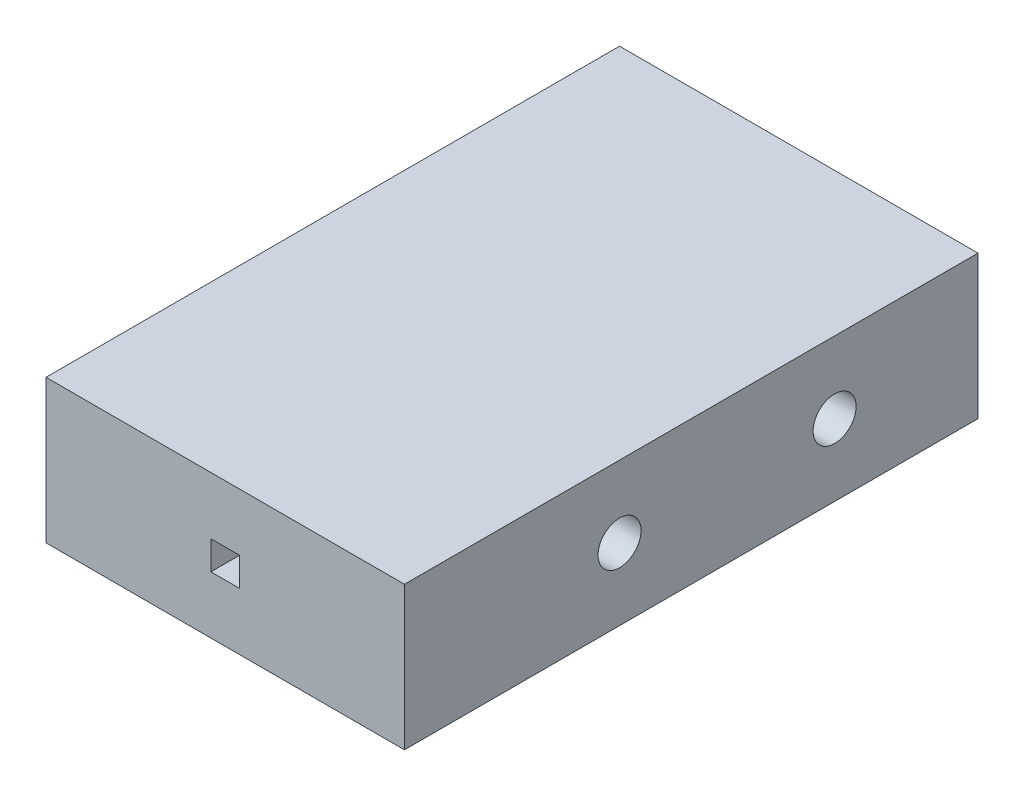
ISO-10303-21;
HEADER;
FILE_DESCRIPTION(('STEP AP214'),'2;1');
FILE_NAME('part.step','',(''),(''),'','','');
FILE_SCHEMA(('AUTOMOTIVE_DESIGN { 1 0 10303 214 1 1 1 1 }'));
ENDSEC;
DATA;
#1=APPLICATION_CONTEXT('core data for automotive mechanical design processes');
#2=APPLICATION_PROTOCOL_DEFINITION('international standard','automotive_design',2000,#1);
#3=PRODUCT_CONTEXT('',#1,'mechanical');
#4=PRODUCT('Part','Part','',(#3));
#5=PRODUCT_RELATED_PRODUCT_CATEGORY('part','',(#4));
#6=PRODUCT_DEFINITION_FORMATION('','',#4);
#7=PRODUCT_DEFINITION_CONTEXT('part definition',#1,'design');
#8=PRODUCT_DEFINITION('design','',#6,#7);
#9=PRODUCT_DEFINITION_SHAPE('','',#8);
#10=(LENGTH_UNIT() NAMED_UNIT(*) SI_UNIT(.MILLI.,.METRE.));
#11=(NAMED_UNIT(*) PLANE_ANGLE_UNIT() SI_UNIT($,.RADIAN.));
#12=(NAMED_UNIT(*) SI_UNIT($,.STERADIAN.) SOLID_ANGLE_UNIT());
#13=UNCERTAINTY_MEASURE_WITH_UNIT(LENGTH_MEASURE(1.E-05),#10,'distance_accuracy_value','');
#14=(GEOMETRIC_REPRESENTATION_CONTEXT(3) GLOBAL_UNCERTAINTY_ASSIGNED_CONTEXT((#13)) GLOBAL_UNIT_ASSIGNED_CONTEXT((#10,
#11,#12)) REPRESENTATION_CONTEXT('',''));
#15=CARTESIAN_POINT('',(0.,0.,0.));
#16=DIRECTION('',(0.,0.,1.));
#17=DIRECTION('',(1.,0.,0.));
#18=AXIS2_PLACEMENT_3D('',#15,#16,#17);
#19=CARTESIAN_POINT('',(-12.5,10.,20.));
#20=DIRECTION('',(1.,0.,0.));
#21=DIRECTION('',(0.,0.,-1.));
#22=AXIS2_PLACEMENT_3D('',#19,#20,#21);
#23=PLANE('',#22);
#24=CARTESIAN_POINT('',(-12.5,5.,5.));
#25=DIRECTION('',(-1.,0.,0.));
#26=DIRECTION('',(0.,0.,1.));
#27=AXIS2_PLACEMENT_3D('',#24,#25,#26);
#28=CIRCLE('',#27,1.5);
#29=CARTESIAN_POINT('',(-12.5,5.,6.50000000000001));
#30=VERTEX_POINT('',#29);
#31=EDGE_CURVE('E219',#30,#30,#28,.T.);
#32=ORIENTED_EDGE('',*,*,#31,.F.);
#33=EDGE_LOOP('',(#32));
#34=FACE_BOUND('',#33,.T.);
#35=CARTESIAN_POINT('',(-12.5,5.,-10.));
#36=DIRECTION('',(1.,0.,0.));
#37=DIRECTION('',(0.,0.,-1.));
#38=AXIS2_PLACEMENT_3D('',#35,#36,#37);
#39=CIRCLE('',#38,1.5);
#40=CARTESIAN_POINT('',(-12.5,5.,-11.5));
#41=VERTEX_POINT('',#40);
#42=EDGE_CURVE('E222',#41,#41,#39,.T.);
#43=ORIENTED_EDGE('',*,*,#42,.T.);
#44=EDGE_LOOP('',(#43));
#45=FACE_BOUND('',#44,.T.);
#46=DIRECTION('',(0.,0.,1.));
#47=VECTOR('',#46,1.);
#48=CARTESIAN_POINT('',(-12.5,0.,20.));
#49=LINE('',#48,#47);
#50=CARTESIAN_POINT('',(-12.5,0.,-20.));
#51=VERTEX_POINT('',#50);
#52=CARTESIAN_POINT('',(-12.5,0.,20.));
#53=VERTEX_POINT('',#52);
#54=EDGE_CURVE('E225',#51,#53,#49,.T.);
#55=ORIENTED_EDGE('',*,*,#54,.T.);
#56=DIRECTION('',(0.,-1.,0.));
#57=VECTOR('',#56,1.);
#58=CARTESIAN_POINT('',(-12.5,10.,20.));
#59=LINE('',#58,#57);
#60=CARTESIAN_POINT('',(-12.5,10.,20.));
#61=VERTEX_POINT('',#60);
#62=EDGE_CURVE('E254',#61,#53,#59,.T.);
#63=ORIENTED_EDGE('',*,*,#62,.F.);
#64=DIRECTION('',(0.,0.,1.));
#65=VECTOR('',#64,1.);
#66=CARTESIAN_POINT('',(-12.5,10.,20.));
#67=LINE('',#66,#65);
#68=CARTESIAN_POINT('',(-12.5,10.,-20.));
#69=VERTEX_POINT('',#68);
#70=EDGE_CURVE('E228',#69,#61,#67,.T.);
#71=ORIENTED_EDGE('',*,*,#70,.F.);
#72=DIRECTION('',(0.,-1.,0.));
#73=VECTOR('',#72,1.);
#74=CARTESIAN_POINT('',(-12.5,10.,-20.));
#75=LINE('',#74,#73);
#76=EDGE_CURVE('E238',#69,#51,#75,.T.);
#77=ORIENTED_EDGE('',*,*,#76,.T.);
#78=EDGE_LOOP('',(#55,#63,#71,#77));
#79=FACE_BOUND('',#78,.T.);
#80=ADVANCED_FACE('F31',(#34,#45,#79),#23,.F.);
#81=CARTESIAN_POINT('',(12.5,10.,20.));
#82=DIRECTION('',(0.,0.,-1.));
#83=DIRECTION('',(-1.,0.,0.));
#84=AXIS2_PLACEMENT_3D('',#81,#82,#83);
#85=PLANE('',#84);
#86=DIRECTION('',(1.,0.,0.));
#87=VECTOR('',#86,1.);
#88=CARTESIAN_POINT('',(1.,4.,20.));
#89=LINE('',#88,#87);
#90=CARTESIAN_POINT('',(-0.999999999999999,4.,20.));
#91=VERTEX_POINT('',#90);
#92=CARTESIAN_POINT('',(1.,4.,20.));
#93=VERTEX_POINT('',#92);
#94=EDGE_CURVE('E181',#91,#93,#89,.T.);
#95=ORIENTED_EDGE('',*,*,#94,.F.);
#96=DIRECTION('',(0.,-1.,0.));
#97=VECTOR('',#96,1.);
#98=CARTESIAN_POINT('',(-0.999999999999998,4.,20.));
#99=LINE('',#98,#97);
#100=CARTESIAN_POINT('',(-0.999999999999998,6.,20.));
#101=VERTEX_POINT('',#100);
#102=EDGE_CURVE('E47',#101,#91,#99,.T.);
#103=ORIENTED_EDGE('',*,*,#102,.F.);
#104=DIRECTION('',(-1.,0.,0.));
#105=VECTOR('',#104,1.);
#106=CARTESIAN_POINT('',(1.,6.,20.));
#107=LINE('',#106,#105);
#108=CARTESIAN_POINT('',(1.,6.,20.));
#109=VERTEX_POINT('',#108);
#110=EDGE_CURVE('E172',#109,#101,#107,.T.);
#111=ORIENTED_EDGE('',*,*,#110,.F.);
#112=DIRECTION('',(0.,1.,0.));
#113=VECTOR('',#112,1.);
#114=CARTESIAN_POINT('',(1.,4.,20.));
#115=LINE('',#114,#113);
#116=EDGE_CURVE('E175',#93,#109,#115,.T.);
#117=ORIENTED_EDGE('',*,*,#116,.F.);
#118=EDGE_LOOP('',(#95,#103,#111,#117));
#119=FACE_BOUND('',#118,.T.);
#120=DIRECTION('',(1.,0.,0.));
#121=VECTOR('',#120,1.);
#122=CARTESIAN_POINT('',(12.5,0.,20.));
#123=LINE('',#122,#121);
#124=CARTESIAN_POINT('',(12.5,0.,20.));
#125=VERTEX_POINT('',#124);
#126=EDGE_CURVE('E241',#53,#125,#123,.T.);
#127=ORIENTED_EDGE('',*,*,#126,.T.);
#128=DIRECTION('',(0.,-1.,0.));
#129=VECTOR('',#128,1.);
#130=CARTESIAN_POINT('',(12.5,10.,20.));
#131=LINE('',#130,#129);
#132=CARTESIAN_POINT('',(12.5,10.,20.));
#133=VERTEX_POINT('',#132);
#134=EDGE_CURVE('E251',#133,#125,#131,.T.);
#135=ORIENTED_EDGE('',*,*,#134,.F.);
#136=DIRECTION('',(1.,0.,0.));
#137=VECTOR('',#136,1.);
#138=CARTESIAN_POINT('',(12.5,10.,20.));
#139=LINE('',#138,#137);
#140=EDGE_CURVE('E231',#61,#133,#139,.T.);
#141=ORIENTED_EDGE('',*,*,#140,.F.);
#142=ORIENTED_EDGE('',*,*,#62,.T.);
#143=EDGE_LOOP('',(#127,#135,#141,#142));
#144=FACE_BOUND('',#143,.T.);
#145=ADVANCED_FACE('F300',(#119,#144),#85,.F.);
#146=CARTESIAN_POINT('',(12.5,10.,20.));
#147=DIRECTION('',(-1.,0.,0.));
#148=DIRECTION('',(0.,0.,1.));
#149=AXIS2_PLACEMENT_3D('',#146,#147,#148);
#150=PLANE('',#149);
#151=CARTESIAN_POINT('',(12.5,5.,5.));
#152=DIRECTION('',(-1.,0.,0.));
#153=DIRECTION('',(0.,0.,1.));
#154=AXIS2_PLACEMENT_3D('',#151,#152,#153);
#155=CIRCLE('',#154,1.5);
#156=CARTESIAN_POINT('',(12.5,5.,6.50000000000001));
#157=VERTEX_POINT('',#156);
#158=EDGE_CURVE('E215',#157,#157,#155,.T.);
#159=ORIENTED_EDGE('',*,*,#158,.T.);
#160=EDGE_LOOP('',(#159));
#161=FACE_BOUND('',#160,.T.);
#162=CARTESIAN_POINT('',(12.5,5.,-10.));
#163=DIRECTION('',(1.,0.,0.));
#164=DIRECTION('',(0.,0.,-1.));
#165=AXIS2_PLACEMENT_3D('',#162,#163,#164);
#166=CIRCLE('',#165,1.5);
#167=CARTESIAN_POINT('',(12.5,5.,-11.5));
#168=VERTEX_POINT('',#167);
#169=EDGE_CURVE('E218',#168,#168,#166,.T.);
#170=ORIENTED_EDGE('',*,*,#169,.F.);
#171=EDGE_LOOP('',(#170));
#172=FACE_BOUND('',#171,.T.);
#173=DIRECTION('',(0.,0.,-1.));
#174=VECTOR('',#173,1.);
#175=CARTESIAN_POINT('',(12.5,0.,20.));
#176=LINE('',#175,#174);
#177=CARTESIAN_POINT('',(12.5,0.,-20.));
#178=VERTEX_POINT('',#177);
#179=EDGE_CURVE('E243',#125,#178,#176,.T.);
#180=ORIENTED_EDGE('',*,*,#179,.T.);
#181=DIRECTION('',(0.,-1.,0.));
#182=VECTOR('',#181,1.);
#183=CARTESIAN_POINT('',(12.5,10.,-20.));
#184=LINE('',#183,#182);
#185=CARTESIAN_POINT('',(12.5,10.,-20.));
#186=VERTEX_POINT('',#185);
#187=EDGE_CURVE('E248',#186,#178,#184,.T.);
#188=ORIENTED_EDGE('',*,*,#187,.F.);
#189=DIRECTION('',(0.,0.,-1.));
#190=VECTOR('',#189,1.);
#191=CARTESIAN_POINT('',(12.5,10.,20.));
#192=LINE('',#191,#190);
#193=EDGE_CURVE('E234',#133,#186,#192,.T.);
#194=ORIENTED_EDGE('',*,*,#193,.F.);
#195=ORIENTED_EDGE('',*,*,#134,.T.);
#196=EDGE_LOOP('',(#180,#188,#194,#195));
#197=FACE_BOUND('',#196,.T.);
#198=ADVANCED_FACE('F328',(#161,#172,#197),#150,.F.);
#199=CARTESIAN_POINT('',(12.5,10.,-20.));
#200=DIRECTION('',(0.,0.,1.));
#201=DIRECTION('',(1.,0.,0.));
#202=AXIS2_PLACEMENT_3D('',#199,#200,#201);
#203=PLANE('',#202);
#204=DIRECTION('',(-1.,0.,0.));
#205=VECTOR('',#204,1.);
#206=CARTESIAN_POINT('',(1.,6.,-20.));
#207=LINE('',#206,#205);
#208=CARTESIAN_POINT('',(1.,6.,-20.));
#209=VERTEX_POINT('',#208);
#210=CARTESIAN_POINT('',(-0.999999999999998,6.,-20.));
#211=VERTEX_POINT('',#210);
#212=EDGE_CURVE('E171',#209,#211,#207,.T.);
#213=ORIENTED_EDGE('',*,*,#212,.T.);
#214=DIRECTION('',(0.,-1.,0.));
#215=VECTOR('',#214,1.);
#216=CARTESIAN_POINT('',(-0.999999999999998,4.,-20.));
#217=LINE('',#216,#215);
#218=CARTESIAN_POINT('',(-0.999999999999998,4.,-20.));
#219=VERTEX_POINT('',#218);
#220=EDGE_CURVE('E152',#211,#219,#217,.T.);
#221=ORIENTED_EDGE('',*,*,#220,.T.);
#222=DIRECTION('',(1.,0.,0.));
#223=VECTOR('',#222,1.);
#224=CARTESIAN_POINT('',(1.,4.,-20.));
#225=LINE('',#224,#223);
#226=CARTESIAN_POINT('',(1.,4.,-20.));
#227=VERTEX_POINT('',#226);
#228=EDGE_CURVE('E163',#219,#227,#225,.T.);
#229=ORIENTED_EDGE('',*,*,#228,.T.);
#230=DIRECTION('',(0.,1.,0.));
#231=VECTOR('',#230,1.);
#232=CARTESIAN_POINT('',(1.,4.,-20.));
#233=LINE('',#232,#231);
#234=EDGE_CURVE('E55',#227,#209,#233,.T.);
#235=ORIENTED_EDGE('',*,*,#234,.T.);
#236=EDGE_LOOP('',(#213,#221,#229,#235));
#237=FACE_BOUND('',#236,.T.);
#238=DIRECTION('',(-1.,0.,0.));
#239=VECTOR('',#238,1.);
#240=CARTESIAN_POINT('',(12.5,0.,-20.));
#241=LINE('',#240,#239);
#242=EDGE_CURVE('E232',#178,#51,#241,.T.);
#243=ORIENTED_EDGE('',*,*,#242,.T.);
#244=ORIENTED_EDGE('',*,*,#76,.F.);
#245=DIRECTION('',(-1.,0.,0.));
#246=VECTOR('',#245,1.);
#247=CARTESIAN_POINT('',(12.5,10.,-20.));
#248=LINE('',#247,#246);
#249=EDGE_CURVE('E236',#186,#69,#248,.T.);
#250=ORIENTED_EDGE('',*,*,#249,.F.);
#251=ORIENTED_EDGE('',*,*,#187,.T.);
#252=EDGE_LOOP('',(#243,#244,#250,#251));
#253=FACE_BOUND('',#252,.T.);
#254=ADVANCED_FACE('F168',(#237,#253),#203,.F.);
#255=CARTESIAN_POINT('',(-12.5,10.,-20.));
#256=DIRECTION('',(0.,1.,0.));
#257=DIRECTION('',(0.,0.,1.));
#258=AXIS2_PLACEMENT_3D('',#255,#256,#257);
#259=PLANE('',#258);
#260=ORIENTED_EDGE('',*,*,#70,.T.);
#261=ORIENTED_EDGE('',*,*,#140,.T.);
#262=ORIENTED_EDGE('',*,*,#193,.T.);
#263=ORIENTED_EDGE('',*,*,#249,.T.);
#264=EDGE_LOOP('',(#260,#261,#262,#263));
#265=FACE_BOUND('',#264,.T.);
#266=ADVANCED_FACE('F344',(#265),#259,.T.);
#267=CARTESIAN_POINT('',(-12.5,0.,-20.));
#268=DIRECTION('',(0.,1.,0.));
#269=DIRECTION('',(0.,0.,1.));
#270=AXIS2_PLACEMENT_3D('',#267,#268,#269);
#271=PLANE('',#270);
#272=ORIENTED_EDGE('',*,*,#54,.F.);
#273=ORIENTED_EDGE('',*,*,#242,.F.);
#274=ORIENTED_EDGE('',*,*,#179,.F.);
#275=ORIENTED_EDGE('',*,*,#126,.F.);
#276=EDGE_LOOP('',(#272,#273,#274,#275));
#277=FACE_BOUND('',#276,.T.);
#278=ADVANCED_FACE('F339',(#277),#271,.F.);
#279=CARTESIAN_POINT('',(-12.5,5.,-10.));
#280=DIRECTION('',(1.,0.,0.));
#281=DIRECTION('',(0.,0.,-1.));
#282=AXIS2_PLACEMENT_3D('',#279,#280,#281);
#283=CYLINDRICAL_SURFACE('',#282,1.5);
#284=DIRECTION('',(1.,0.,0.));
#285=VECTOR('',#284,1.);
#286=CARTESIAN_POINT('',(-12.5,4.,-11.1180339887499));
#287=LINE('',#286,#285);
#288=CARTESIAN_POINT('',(1.,4.,-11.1180339887499));
#289=VERTEX_POINT('',#288);
#290=CARTESIAN_POINT('',(-0.999999999999999,4.,-11.1180339887499));
#291=VERTEX_POINT('',#290);
#292=EDGE_CURVE('E200',#289,#291,#287,.F.);
#293=ORIENTED_EDGE('',*,*,#292,.T.);
#294=CARTESIAN_POINT('',(-0.999999999999999,5.,-10.));
#295=DIRECTION('',(-1.,0.,0.));
#296=DIRECTION('',(0.,0.,1.));
#297=AXIS2_PLACEMENT_3D('',#294,#295,#296);
#298=CIRCLE('',#297,1.5);
#299=CARTESIAN_POINT('',(-0.999999999999998,6.,-11.1180339887499));
#300=VERTEX_POINT('',#299);
#301=EDGE_CURVE('E155',#291,#300,#298,.F.);
#302=ORIENTED_EDGE('',*,*,#301,.T.);
#303=DIRECTION('',(1.,0.,0.));
#304=VECTOR('',#303,1.);
#305=CARTESIAN_POINT('',(-12.5,6.,-11.1180339887499));
#306=LINE('',#305,#304);
#307=CARTESIAN_POINT('',(1.,6.,-11.1180339887499));
#308=VERTEX_POINT('',#307);
#309=EDGE_CURVE('E206',#300,#308,#306,.T.);
#310=ORIENTED_EDGE('',*,*,#309,.T.);
#311=CARTESIAN_POINT('',(1.,5.,-10.));
#312=DIRECTION('',(1.,0.,0.));
#313=DIRECTION('',(0.,0.,-1.));
#314=AXIS2_PLACEMENT_3D('',#311,#312,#313);
#315=CIRCLE('',#314,1.5);
#316=EDGE_CURVE('E202',#308,#289,#315,.F.);
#317=ORIENTED_EDGE('',*,*,#316,.T.);
#318=EDGE_LOOP('',(#293,#302,#310,#317));
#319=FACE_BOUND('',#318,.T.);
#320=DIRECTION('',(1.,0.,0.));
#321=VECTOR('',#320,1.);
#322=CARTESIAN_POINT('',(-12.5,6.,-8.8819660112501));
#323=LINE('',#322,#321);
#324=CARTESIAN_POINT('',(1.,6.,-8.8819660112501));
#325=VERTEX_POINT('',#324);
#326=CARTESIAN_POINT('',(-0.999999999999998,6.,-8.8819660112501));
#327=VERTEX_POINT('',#326);
#328=EDGE_CURVE('E209',#325,#327,#323,.F.);
#329=ORIENTED_EDGE('',*,*,#328,.T.);
#330=CARTESIAN_POINT('',(-0.999999999999998,4.,-8.88196601125011));
#331=VERTEX_POINT('',#330);
#332=EDGE_CURVE('E212',#327,#331,#298,.F.);
#333=ORIENTED_EDGE('',*,*,#332,.T.);
#334=DIRECTION('',(1.,0.,0.));
#335=VECTOR('',#334,1.);
#336=CARTESIAN_POINT('',(-12.5,4.,-8.88196601125011));
#337=LINE('',#336,#335);
#338=CARTESIAN_POINT('',(1.,4.,-8.88196601125011));
#339=VERTEX_POINT('',#338);
#340=EDGE_CURVE('E188',#331,#339,#337,.T.);
#341=ORIENTED_EDGE('',*,*,#340,.T.);
#342=EDGE_CURVE('E205',#339,#325,#315,.F.);
#343=ORIENTED_EDGE('',*,*,#342,.T.);
#344=EDGE_LOOP('',(#329,#333,#341,#343));
#345=FACE_BOUND('',#344,.T.);
#346=ORIENTED_EDGE('',*,*,#42,.F.);
#347=EDGE_LOOP('',(#346));
#348=FACE_BOUND('',#347,.T.);
#349=ORIENTED_EDGE('',*,*,#169,.T.);
#350=EDGE_LOOP('',(#349));
#351=FACE_BOUND('',#350,.T.);
#352=ADVANCED_FACE('F308',(#319,#345,#348,#351),#283,.F.);
#353=CARTESIAN_POINT('',(12.5,5.,5.));
#354=DIRECTION('',(-1.,0.,0.));
#355=DIRECTION('',(0.,0.,1.));
#356=AXIS2_PLACEMENT_3D('',#353,#354,#355);
#357=CYLINDRICAL_SURFACE('',#356,1.5);
#358=DIRECTION('',(-1.,0.,0.));
#359=VECTOR('',#358,1.);
#360=CARTESIAN_POINT('',(12.5,6.,6.1180339887499));
#361=LINE('',#360,#359);
#362=CARTESIAN_POINT('',(1.,6.,6.1180339887499));
#363=VERTEX_POINT('',#362);
#364=CARTESIAN_POINT('',(-0.999999999999998,6.,6.1180339887499));
#365=VERTEX_POINT('',#364);
#366=EDGE_CURVE('E34',#363,#365,#361,.T.);
#367=ORIENTED_EDGE('',*,*,#366,.T.);
#368=CARTESIAN_POINT('',(-0.999999999999999,5.,5.));
#369=DIRECTION('',(-1.,0.,0.));
#370=DIRECTION('',(0.,0.,1.));
#371=AXIS2_PLACEMENT_3D('',#368,#369,#370);
#372=CIRCLE('',#371,1.5);
#373=CARTESIAN_POINT('',(-0.999999999999998,4.,6.1180339887499));
#374=VERTEX_POINT('',#373);
#375=EDGE_CURVE('E11',#365,#374,#372,.F.);
#376=ORIENTED_EDGE('',*,*,#375,.T.);
#377=DIRECTION('',(-1.,0.,0.));
#378=VECTOR('',#377,1.);
#379=CARTESIAN_POINT('',(12.5,4.,6.1180339887499));
#380=LINE('',#379,#378);
#381=CARTESIAN_POINT('',(1.,4.,6.1180339887499));
#382=VERTEX_POINT('',#381);
#383=EDGE_CURVE('E267',#374,#382,#380,.F.);
#384=ORIENTED_EDGE('',*,*,#383,.T.);
#385=CARTESIAN_POINT('',(1.,5.,5.));
#386=DIRECTION('',(1.,0.,0.));
#387=DIRECTION('',(0.,0.,-1.));
#388=AXIS2_PLACEMENT_3D('',#385,#386,#387);
#389=CIRCLE('',#388,1.5);
#390=EDGE_CURVE('E264',#382,#363,#389,.F.);
#391=ORIENTED_EDGE('',*,*,#390,.T.);
#392=EDGE_LOOP('',(#367,#376,#384,#391));
#393=FACE_BOUND('',#392,.T.);
#394=DIRECTION('',(-1.,0.,0.));
#395=VECTOR('',#394,1.);
#396=CARTESIAN_POINT('',(12.5,4.,3.88196601125011));
#397=LINE('',#396,#395);
#398=CARTESIAN_POINT('',(1.,4.,3.88196601125011));
#399=VERTEX_POINT('',#398);
#400=CARTESIAN_POINT('',(-0.999999999999999,4.,3.88196601125011));
#401=VERTEX_POINT('',#400);
#402=EDGE_CURVE('E257',#399,#401,#397,.T.);
#403=ORIENTED_EDGE('',*,*,#402,.T.);
#404=CARTESIAN_POINT('',(-0.999999999999998,6.,3.88196601125011));
#405=VERTEX_POINT('',#404);
#406=EDGE_CURVE('E40',#401,#405,#372,.F.);
#407=ORIENTED_EDGE('',*,*,#406,.T.);
#408=DIRECTION('',(-1.,0.,0.));
#409=VECTOR('',#408,1.);
#410=CARTESIAN_POINT('',(12.5,6.,3.88196601125011));
#411=LINE('',#410,#409);
#412=CARTESIAN_POINT('',(1.,6.,3.88196601125011));
#413=VERTEX_POINT('',#412);
#414=EDGE_CURVE('E263',#405,#413,#411,.F.);
#415=ORIENTED_EDGE('',*,*,#414,.T.);
#416=EDGE_CURVE('E260',#413,#399,#389,.F.);
#417=ORIENTED_EDGE('',*,*,#416,.T.);
#418=EDGE_LOOP('',(#403,#407,#415,#417));
#419=FACE_BOUND('',#418,.T.);
#420=ORIENTED_EDGE('',*,*,#158,.F.);
#421=EDGE_LOOP('',(#420));
#422=FACE_BOUND('',#421,.T.);
#423=ORIENTED_EDGE('',*,*,#31,.T.);
#424=EDGE_LOOP('',(#423));
#425=FACE_BOUND('',#424,.T.);
#426=ADVANCED_FACE('F273',(#393,#419,#422,#425),#357,.F.);
#427=CARTESIAN_POINT('',(1.,4.,-20.));
#428=DIRECTION('',(0.,-1.,0.));
#429=DIRECTION('',(0.,0.,-1.));
#430=AXIS2_PLACEMENT_3D('',#427,#428,#429);
#431=PLANE('',#430);
#432=DIRECTION('',(0.,0.,1.));
#433=VECTOR('',#432,1.);
#434=CARTESIAN_POINT('',(-0.999999999999998,4.,-20.));
#435=LINE('',#434,#433);
#436=EDGE_CURVE('E159',#331,#401,#435,.T.);
#437=ORIENTED_EDGE('',*,*,#436,.T.);
#438=ORIENTED_EDGE('',*,*,#402,.F.);
#439=DIRECTION('',(0.,0.,1.));
#440=VECTOR('',#439,1.);
#441=CARTESIAN_POINT('',(1.,4.,-20.));
#442=LINE('',#441,#440);
#443=EDGE_CURVE('E196',#339,#399,#442,.T.);
#444=ORIENTED_EDGE('',*,*,#443,.F.);
#445=ORIENTED_EDGE('',*,*,#340,.F.);
#446=EDGE_LOOP('',(#437,#438,#444,#445));
#447=FACE_BOUND('',#446,.T.);
#448=ADVANCED_FACE('F305',(#447),#431,.F.);
#449=CARTESIAN_POINT('',(1.,4.,-20.));
#450=DIRECTION('',(1.,0.,0.));
#451=DIRECTION('',(0.,0.,-1.));
#452=AXIS2_PLACEMENT_3D('',#449,#450,#451);
#453=PLANE('',#452);
#454=ORIENTED_EDGE('',*,*,#443,.T.);
#455=ORIENTED_EDGE('',*,*,#416,.F.);
#456=DIRECTION('',(0.,0.,1.));
#457=VECTOR('',#456,1.);
#458=CARTESIAN_POINT('',(1.,6.,-20.));
#459=LINE('',#458,#457);
#460=EDGE_CURVE('E194',#325,#413,#459,.T.);
#461=ORIENTED_EDGE('',*,*,#460,.F.);
#462=ORIENTED_EDGE('',*,*,#342,.F.);
#463=EDGE_LOOP('',(#454,#455,#461,#462));
#464=FACE_BOUND('',#463,.T.);
#465=ADVANCED_FACE('F310',(#464),#453,.F.);
#466=CARTESIAN_POINT('',(1.,6.,-20.));
#467=DIRECTION('',(0.,1.,0.));
#468=DIRECTION('',(0.,0.,1.));
#469=AXIS2_PLACEMENT_3D('',#466,#467,#468);
#470=PLANE('',#469);
#471=ORIENTED_EDGE('',*,*,#460,.T.);
#472=ORIENTED_EDGE('',*,*,#414,.F.);
#473=DIRECTION('',(0.,0.,1.));
#474=VECTOR('',#473,1.);
#475=CARTESIAN_POINT('',(-0.999999999999998,6.,-20.));
#476=LINE('',#475,#474);
#477=EDGE_CURVE('E189',#327,#405,#476,.T.);
#478=ORIENTED_EDGE('',*,*,#477,.F.);
#479=ORIENTED_EDGE('',*,*,#328,.F.);
#480=EDGE_LOOP('',(#471,#472,#478,#479));
#481=FACE_BOUND('',#480,.T.);
#482=ADVANCED_FACE('F286',(#481),#470,.F.);
#483=CARTESIAN_POINT('',(-0.999999999999998,4.,-20.));
#484=DIRECTION('',(-1.,0.,0.));
#485=DIRECTION('',(0.,0.,1.));
#486=AXIS2_PLACEMENT_3D('',#483,#484,#485);
#487=PLANE('',#486);
#488=ORIENTED_EDGE('',*,*,#477,.T.);
#489=ORIENTED_EDGE('',*,*,#406,.F.);
#490=ORIENTED_EDGE('',*,*,#436,.F.);
#491=ORIENTED_EDGE('',*,*,#332,.F.);
#492=EDGE_LOOP('',(#488,#489,#490,#491));
#493=FACE_BOUND('',#492,.T.);
#494=ADVANCED_FACE('F296',(#493),#487,.F.);
#495=EDGE_CURVE('E161',#374,#91,#435,.T.);
#496=ORIENTED_EDGE('',*,*,#495,.T.);
#497=ORIENTED_EDGE('',*,*,#94,.T.);
#498=EDGE_CURVE('E158',#382,#93,#442,.T.);
#499=ORIENTED_EDGE('',*,*,#498,.F.);
#500=ORIENTED_EDGE('',*,*,#383,.F.);
#501=EDGE_LOOP('',(#496,#497,#499,#500));
#502=FACE_BOUND('',#501,.T.);
#503=ADVANCED_FACE('F303',(#502),#431,.F.);
#504=ORIENTED_EDGE('',*,*,#498,.T.);
#505=ORIENTED_EDGE('',*,*,#116,.T.);
#506=EDGE_CURVE('E195',#363,#109,#459,.T.);
#507=ORIENTED_EDGE('',*,*,#506,.F.);
#508=ORIENTED_EDGE('',*,*,#390,.F.);
#509=EDGE_LOOP('',(#504,#505,#507,#508));
#510=FACE_BOUND('',#509,.T.);
#511=ADVANCED_FACE('F280',(#510),#453,.F.);
#512=ORIENTED_EDGE('',*,*,#506,.T.);
#513=ORIENTED_EDGE('',*,*,#110,.T.);
#514=EDGE_CURVE('E190',#365,#101,#476,.T.);
#515=ORIENTED_EDGE('',*,*,#514,.F.);
#516=ORIENTED_EDGE('',*,*,#366,.F.);
#517=EDGE_LOOP('',(#512,#513,#515,#516));
#518=FACE_BOUND('',#517,.T.);
#519=ADVANCED_FACE('F278',(#518),#470,.F.);
#520=ORIENTED_EDGE('',*,*,#514,.T.);
#521=ORIENTED_EDGE('',*,*,#102,.T.);
#522=ORIENTED_EDGE('',*,*,#495,.F.);
#523=ORIENTED_EDGE('',*,*,#375,.F.);
#524=EDGE_LOOP('',(#520,#521,#522,#523));
#525=FACE_BOUND('',#524,.T.);
#526=ADVANCED_FACE('F297',(#525),#487,.F.);
#527=EDGE_CURVE('E147',#219,#291,#435,.T.);
#528=ORIENTED_EDGE('',*,*,#527,.F.);
#529=ORIENTED_EDGE('',*,*,#220,.F.);
#530=EDGE_CURVE('E186',#211,#300,#476,.T.);
#531=ORIENTED_EDGE('',*,*,#530,.T.);
#532=ORIENTED_EDGE('',*,*,#301,.F.);
#533=EDGE_LOOP('',(#528,#529,#531,#532));
#534=FACE_BOUND('',#533,.T.);
#535=ADVANCED_FACE('F149',(#534),#487,.F.);
#536=ORIENTED_EDGE('',*,*,#530,.F.);
#537=ORIENTED_EDGE('',*,*,#212,.F.);
#538=EDGE_CURVE('E191',#209,#308,#459,.T.);
#539=ORIENTED_EDGE('',*,*,#538,.T.);
#540=ORIENTED_EDGE('',*,*,#309,.F.);
#541=EDGE_LOOP('',(#536,#537,#539,#540));
#542=FACE_BOUND('',#541,.T.);
#543=ADVANCED_FACE('F319',(#542),#470,.F.);
#544=ORIENTED_EDGE('',*,*,#538,.F.);
#545=ORIENTED_EDGE('',*,*,#234,.F.);
#546=EDGE_CURVE('E165',#227,#289,#442,.T.);
#547=ORIENTED_EDGE('',*,*,#546,.T.);
#548=ORIENTED_EDGE('',*,*,#316,.F.);
#549=EDGE_LOOP('',(#544,#545,#547,#548));
#550=FACE_BOUND('',#549,.T.);
#551=ADVANCED_FACE('F313',(#550),#453,.F.);
#552=ORIENTED_EDGE('',*,*,#546,.F.);
#553=ORIENTED_EDGE('',*,*,#228,.F.);
#554=ORIENTED_EDGE('',*,*,#527,.T.);
#555=ORIENTED_EDGE('',*,*,#292,.F.);
#556=EDGE_LOOP('',(#552,#553,#554,#555));
#557=FACE_BOUND('',#556,.T.);
#558=ADVANCED_FACE('F164',(#557),#431,.F.);
#559=CLOSED_SHELL('',(#80,#145,#198,#254,#266,#278,#352,#426,#448,#465,#482,#494,#503,#511,#519,
#526,#535,#543,#551,#558));
#560=MANIFOLD_SOLID_BREP('B2',#559);
#561=ADVANCED_BREP_SHAPE_REPRESENTATION('',(#18,#560),#14);
#562=SHAPE_DEFINITION_REPRESENTATION(#9,#561);
ENDSEC;
END-ISO-10303-21;
